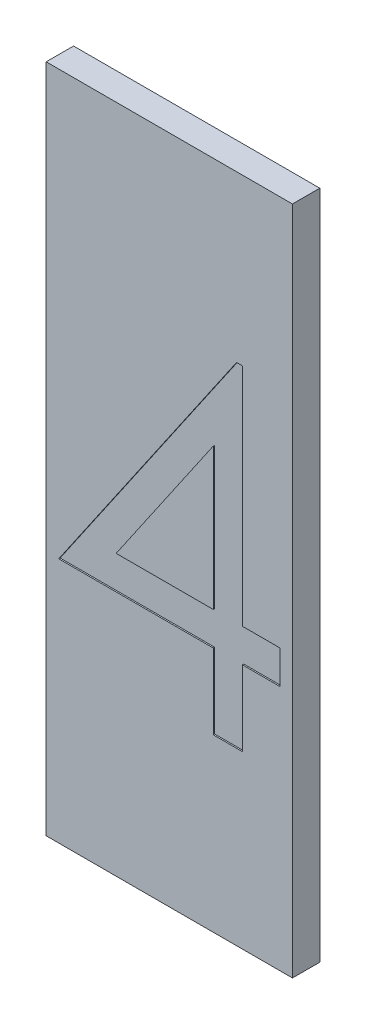
ISO-10303-21;
HEADER;
FILE_DESCRIPTION(('STEP AP214'),'2;1');
FILE_NAME('part.step','',(''),(''),'','','');
FILE_SCHEMA(('AUTOMOTIVE_DESIGN { 1 0 10303 214 1 1 1 1 }'));
ENDSEC;
DATA;
#1=APPLICATION_CONTEXT('core data for automotive mechanical design processes');
#2=APPLICATION_PROTOCOL_DEFINITION('international standard','automotive_design',2000,#1);
#3=PRODUCT_CONTEXT('',#1,'mechanical');
#4=PRODUCT('Part','Part','',(#3));
#5=PRODUCT_RELATED_PRODUCT_CATEGORY('part','',(#4));
#6=PRODUCT_DEFINITION_FORMATION('','',#4);
#7=PRODUCT_DEFINITION_CONTEXT('part definition',#1,'design');
#8=PRODUCT_DEFINITION('design','',#6,#7);
#9=PRODUCT_DEFINITION_SHAPE('','',#8);
#10=(LENGTH_UNIT() NAMED_UNIT(*) SI_UNIT(.MILLI.,.METRE.));
#11=(NAMED_UNIT(*) PLANE_ANGLE_UNIT() SI_UNIT($,.RADIAN.));
#12=(NAMED_UNIT(*) SI_UNIT($,.STERADIAN.) SOLID_ANGLE_UNIT());
#13=UNCERTAINTY_MEASURE_WITH_UNIT(LENGTH_MEASURE(1.E-05),#10,'distance_accuracy_value','');
#14=(GEOMETRIC_REPRESENTATION_CONTEXT(3) GLOBAL_UNCERTAINTY_ASSIGNED_CONTEXT((#13)) GLOBAL_UNIT_ASSIGNED_CONTEXT((#10,
#11,#12)) REPRESENTATION_CONTEXT('',''));
#15=CARTESIAN_POINT('',(0.,0.,0.));
#16=DIRECTION('',(0.,0.,1.));
#17=DIRECTION('',(1.,0.,0.));
#18=AXIS2_PLACEMENT_3D('',#15,#16,#17);
#19=CARTESIAN_POINT('',(0.,0.,2.));
#20=DIRECTION('',(0.,0.,1.));
#21=DIRECTION('',(1.,0.,0.));
#22=AXIS2_PLACEMENT_3D('',#19,#20,#21);
#23=PLANE('',#22);
#24=DIRECTION('',(0.,-1.,0.));
#25=VECTOR('',#24,1.);
#26=CARTESIAN_POINT('',(0.,0.,2.));
#27=LINE('',#26,#25);
#28=CARTESIAN_POINT('',(0.,49.,2.));
#29=VERTEX_POINT('',#28);
#30=CARTESIAN_POINT('',(0.,0.,2.));
#31=VERTEX_POINT('',#30);
#32=EDGE_CURVE('E256',#29,#31,#27,.T.);
#33=ORIENTED_EDGE('',*,*,#32,.T.);
#34=DIRECTION('',(1.,0.,0.));
#35=VECTOR('',#34,1.);
#36=CARTESIAN_POINT('',(18.,0.,2.));
#37=LINE('',#36,#35);
#38=CARTESIAN_POINT('',(18.,0.,2.));
#39=VERTEX_POINT('',#38);
#40=EDGE_CURVE('E259',#31,#39,#37,.T.);
#41=ORIENTED_EDGE('',*,*,#40,.T.);
#42=DIRECTION('',(0.,1.,0.));
#43=VECTOR('',#42,1.);
#44=CARTESIAN_POINT('',(18.,0.,2.));
#45=LINE('',#44,#43);
#46=CARTESIAN_POINT('',(18.,49.,2.));
#47=VERTEX_POINT('',#46);
#48=EDGE_CURVE('E262',#39,#47,#45,.T.);
#49=ORIENTED_EDGE('',*,*,#48,.T.);
#50=DIRECTION('',(-1.,0.,0.));
#51=VECTOR('',#50,1.);
#52=CARTESIAN_POINT('',(18.,49.,2.));
#53=LINE('',#52,#51);
#54=EDGE_CURVE('E264',#47,#29,#53,.T.);
#55=ORIENTED_EDGE('',*,*,#54,.T.);
#56=EDGE_LOOP('',(#33,#41,#49,#55));
#57=FACE_BOUND('',#56,.T.);
#58=DIRECTION('',(-1.,0.,0.));
#59=VECTOR('',#58,1.);
#60=CARTESIAN_POINT('',(12.2115384615385,17.9951923076923,2.));
#61=LINE('',#60,#59);
#62=CARTESIAN_POINT('',(12.2115384615385,17.9951923076923,2.));
#63=VERTEX_POINT('',#62);
#64=CARTESIAN_POINT('',(0.915865384615385,17.9951923076923,2.));
#65=VERTEX_POINT('',#64);
#66=EDGE_CURVE('E190',#63,#65,#61,.T.);
#67=ORIENTED_EDGE('',*,*,#66,.T.);
#68=DIRECTION('',(0.566105543193208,0.824332768950697,0.));
#69=VECTOR('',#68,1.);
#70=CARTESIAN_POINT('',(0.915865384615385,17.9951923076923,2.));
#71=LINE('',#70,#69);
#72=CARTESIAN_POINT('',(13.9144756610577,36.9230769230769,2.));
#73=VERTEX_POINT('',#72);
#74=EDGE_CURVE('E48',#65,#73,#71,.T.);
#75=ORIENTED_EDGE('',*,*,#74,.T.);
#76=DIRECTION('',(1.,0.,0.));
#77=VECTOR('',#76,1.);
#78=CARTESIAN_POINT('',(13.9144756610577,36.9230769230769,2.));
#79=LINE('',#78,#77);
#80=CARTESIAN_POINT('',(14.3485576923077,36.9230769230769,2.));
#81=VERTEX_POINT('',#80);
#82=EDGE_CURVE('E210',#73,#81,#79,.T.);
#83=ORIENTED_EDGE('',*,*,#82,.T.);
#84=DIRECTION('',(0.,-1.,0.));
#85=VECTOR('',#84,1.);
#86=CARTESIAN_POINT('',(14.3485576923077,36.9230769230769,2.));
#87=LINE('',#86,#85);
#88=CARTESIAN_POINT('',(14.3485576923077,20.4375,2.));
#89=VERTEX_POINT('',#88);
#90=EDGE_CURVE('E213',#81,#89,#87,.T.);
#91=ORIENTED_EDGE('',*,*,#90,.T.);
#92=DIRECTION('',(1.,0.,0.));
#93=VECTOR('',#92,1.);
#94=CARTESIAN_POINT('',(14.3485576923077,20.4375,2.));
#95=LINE('',#94,#93);
#96=CARTESIAN_POINT('',(17.0961538461538,20.4375,2.));
#97=VERTEX_POINT('',#96);
#98=EDGE_CURVE('E216',#89,#97,#95,.T.);
#99=ORIENTED_EDGE('',*,*,#98,.T.);
#100=DIRECTION('',(0.,-1.,0.));
#101=VECTOR('',#100,1.);
#102=CARTESIAN_POINT('',(17.0961538461538,20.4375,2.));
#103=LINE('',#102,#101);
#104=CARTESIAN_POINT('',(17.0961538461538,17.9951923076923,2.));
#105=VERTEX_POINT('',#104);
#106=EDGE_CURVE('E219',#97,#105,#103,.T.);
#107=ORIENTED_EDGE('',*,*,#106,.T.);
#108=DIRECTION('',(-1.,0.,0.));
#109=VECTOR('',#108,1.);
#110=CARTESIAN_POINT('',(17.0961538461538,17.9951923076923,2.));
#111=LINE('',#110,#109);
#112=CARTESIAN_POINT('',(14.3485576923077,17.9951923076923,2.));
#113=VERTEX_POINT('',#112);
#114=EDGE_CURVE('E222',#105,#113,#111,.T.);
#115=ORIENTED_EDGE('',*,*,#114,.T.);
#116=DIRECTION('',(0.,-1.,0.));
#117=VECTOR('',#116,1.);
#118=CARTESIAN_POINT('',(14.3485576923077,17.9951923076923,2.));
#119=LINE('',#118,#117);
#120=CARTESIAN_POINT('',(14.3485576923077,12.5,2.));
#121=VERTEX_POINT('',#120);
#122=EDGE_CURVE('E225',#113,#121,#119,.T.);
#123=ORIENTED_EDGE('',*,*,#122,.T.);
#124=DIRECTION('',(-1.,0.,0.));
#125=VECTOR('',#124,1.);
#126=CARTESIAN_POINT('',(14.3485576923077,12.5,2.));
#127=LINE('',#126,#125);
#128=CARTESIAN_POINT('',(12.2115384615385,12.5,2.));
#129=VERTEX_POINT('',#128);
#130=EDGE_CURVE('E228',#121,#129,#127,.T.);
#131=ORIENTED_EDGE('',*,*,#130,.T.);
#132=DIRECTION('',(0.,1.,0.));
#133=VECTOR('',#132,1.);
#134=CARTESIAN_POINT('',(12.2115384615385,12.5,2.));
#135=LINE('',#134,#133);
#136=EDGE_CURVE('E231',#129,#63,#135,.T.);
#137=ORIENTED_EDGE('',*,*,#136,.T.);
#138=EDGE_LOOP('',(#67,#75,#83,#91,#99,#107,#115,#123,#131,#137));
#139=FACE_BOUND('',#138,.T.);
#140=ADVANCED_FACE('F33',(#57,#139),#23,.T.);
#141=CARTESIAN_POINT('',(0.,0.,2.));
#142=DIRECTION('',(1.,0.,0.));
#143=DIRECTION('',(0.,0.,-1.));
#144=AXIS2_PLACEMENT_3D('',#141,#142,#143);
#145=PLANE('',#144);
#146=DIRECTION('',(0.,-1.,0.));
#147=VECTOR('',#146,1.);
#148=CARTESIAN_POINT('',(0.,0.,0.));
#149=LINE('',#148,#147);
#150=CARTESIAN_POINT('',(0.,49.,0.));
#151=VERTEX_POINT('',#150);
#152=CARTESIAN_POINT('',(0.,0.,0.));
#153=VERTEX_POINT('',#152);
#154=EDGE_CURVE('E255',#151,#153,#149,.T.);
#155=ORIENTED_EDGE('',*,*,#154,.T.);
#156=DIRECTION('',(0.,0.,-1.));
#157=VECTOR('',#156,1.);
#158=CARTESIAN_POINT('',(0.,0.,2.));
#159=LINE('',#158,#157);
#160=EDGE_CURVE('E11',#31,#153,#159,.T.);
#161=ORIENTED_EDGE('',*,*,#160,.F.);
#162=ORIENTED_EDGE('',*,*,#32,.F.);
#163=DIRECTION('',(0.,0.,-1.));
#164=VECTOR('',#163,1.);
#165=CARTESIAN_POINT('',(0.,49.,2.));
#166=LINE('',#165,#164);
#167=EDGE_CURVE('E266',#29,#151,#166,.T.);
#168=ORIENTED_EDGE('',*,*,#167,.T.);
#169=EDGE_LOOP('',(#155,#161,#162,#168));
#170=FACE_BOUND('',#169,.T.);
#171=ADVANCED_FACE('F35',(#170),#145,.F.);
#172=CARTESIAN_POINT('',(18.,0.,2.));
#173=DIRECTION('',(0.,1.,0.));
#174=DIRECTION('',(0.,0.,1.));
#175=AXIS2_PLACEMENT_3D('',#172,#173,#174);
#176=PLANE('',#175);
#177=DIRECTION('',(1.,0.,0.));
#178=VECTOR('',#177,1.);
#179=CARTESIAN_POINT('',(18.,0.,0.));
#180=LINE('',#179,#178);
#181=CARTESIAN_POINT('',(18.,0.,0.));
#182=VERTEX_POINT('',#181);
#183=EDGE_CURVE('E269',#153,#182,#180,.T.);
#184=ORIENTED_EDGE('',*,*,#183,.T.);
#185=DIRECTION('',(0.,0.,-1.));
#186=VECTOR('',#185,1.);
#187=CARTESIAN_POINT('',(18.,0.,2.));
#188=LINE('',#187,#186);
#189=EDGE_CURVE('E41',#39,#182,#188,.T.);
#190=ORIENTED_EDGE('',*,*,#189,.F.);
#191=ORIENTED_EDGE('',*,*,#40,.F.);
#192=ORIENTED_EDGE('',*,*,#160,.T.);
#193=EDGE_LOOP('',(#184,#190,#191,#192));
#194=FACE_BOUND('',#193,.T.);
#195=ADVANCED_FACE('F299',(#194),#176,.F.);
#196=CARTESIAN_POINT('',(18.,0.,2.));
#197=DIRECTION('',(-1.,0.,0.));
#198=DIRECTION('',(0.,0.,1.));
#199=AXIS2_PLACEMENT_3D('',#196,#197,#198);
#200=PLANE('',#199);
#201=DIRECTION('',(0.,1.,0.));
#202=VECTOR('',#201,1.);
#203=CARTESIAN_POINT('',(18.,0.,0.));
#204=LINE('',#203,#202);
#205=CARTESIAN_POINT('',(18.,49.,0.));
#206=VERTEX_POINT('',#205);
#207=EDGE_CURVE('E271',#182,#206,#204,.T.);
#208=ORIENTED_EDGE('',*,*,#207,.T.);
#209=DIRECTION('',(0.,0.,-1.));
#210=VECTOR('',#209,1.);
#211=CARTESIAN_POINT('',(18.,49.,2.));
#212=LINE('',#211,#210);
#213=EDGE_CURVE('E276',#47,#206,#212,.T.);
#214=ORIENTED_EDGE('',*,*,#213,.F.);
#215=ORIENTED_EDGE('',*,*,#48,.F.);
#216=ORIENTED_EDGE('',*,*,#189,.T.);
#217=EDGE_LOOP('',(#208,#214,#215,#216));
#218=FACE_BOUND('',#217,.T.);
#219=ADVANCED_FACE('F283',(#218),#200,.F.);
#220=CARTESIAN_POINT('',(18.,49.,2.));
#221=DIRECTION('',(0.,-1.,0.));
#222=DIRECTION('',(0.,0.,-1.));
#223=AXIS2_PLACEMENT_3D('',#220,#221,#222);
#224=PLANE('',#223);
#225=DIRECTION('',(-1.,0.,0.));
#226=VECTOR('',#225,1.);
#227=CARTESIAN_POINT('',(18.,49.,0.));
#228=LINE('',#227,#226);
#229=EDGE_CURVE('E260',#206,#151,#228,.T.);
#230=ORIENTED_EDGE('',*,*,#229,.T.);
#231=ORIENTED_EDGE('',*,*,#167,.F.);
#232=ORIENTED_EDGE('',*,*,#54,.F.);
#233=ORIENTED_EDGE('',*,*,#213,.T.);
#234=EDGE_LOOP('',(#230,#231,#232,#233));
#235=FACE_BOUND('',#234,.T.);
#236=ADVANCED_FACE('F292',(#235),#224,.F.);
#237=CARTESIAN_POINT('',(0.,0.,0.));
#238=DIRECTION('',(0.,0.,1.));
#239=DIRECTION('',(1.,0.,0.));
#240=AXIS2_PLACEMENT_3D('',#237,#238,#239);
#241=PLANE('',#240);
#242=ORIENTED_EDGE('',*,*,#154,.F.);
#243=ORIENTED_EDGE('',*,*,#229,.F.);
#244=ORIENTED_EDGE('',*,*,#207,.F.);
#245=ORIENTED_EDGE('',*,*,#183,.F.);
#246=EDGE_LOOP('',(#242,#243,#244,#245));
#247=FACE_BOUND('',#246,.T.);
#248=ADVANCED_FACE('F289',(#247),#241,.F.);
#249=CARTESIAN_POINT('',(0.915865384615385,17.9951923076923,1.9));
#250=DIRECTION('',(0.824332768950697,-0.566105543193208,0.));
#251=DIRECTION('',(0.566105543193208,0.824332768950697,0.));
#252=AXIS2_PLACEMENT_3D('',#249,#250,#251);
#253=PLANE('',#252);
#254=ORIENTED_EDGE('',*,*,#74,.F.);
#255=DIRECTION('',(0.,0.,1.));
#256=VECTOR('',#255,1.);
#257=CARTESIAN_POINT('',(0.915865384615385,17.9951923076923,1.9));
#258=LINE('',#257,#256);
#259=CARTESIAN_POINT('',(0.915865384615385,17.9951923076923,1.9));
#260=VERTEX_POINT('',#259);
#261=EDGE_CURVE('E208',#260,#65,#258,.T.);
#262=ORIENTED_EDGE('',*,*,#261,.F.);
#263=DIRECTION('',(0.566105543193208,0.824332768950697,0.));
#264=VECTOR('',#263,1.);
#265=CARTESIAN_POINT('',(0.915865384615385,17.9951923076923,1.9));
#266=LINE('',#265,#264);
#267=CARTESIAN_POINT('',(13.9144756610577,36.9230769230769,1.9));
#268=VERTEX_POINT('',#267);
#269=EDGE_CURVE('E186',#260,#268,#266,.T.);
#270=ORIENTED_EDGE('',*,*,#269,.T.);
#271=DIRECTION('',(0.,0.,1.));
#272=VECTOR('',#271,1.);
#273=CARTESIAN_POINT('',(13.9144756610577,36.9230769230769,1.9));
#274=LINE('',#273,#272);
#275=EDGE_CURVE('E253',#268,#73,#274,.T.);
#276=ORIENTED_EDGE('',*,*,#275,.T.);
#277=EDGE_LOOP('',(#254,#262,#270,#276));
#278=FACE_BOUND('',#277,.T.);
#279=ADVANCED_FACE('F363',(#278),#253,.T.);
#280=CARTESIAN_POINT('',(13.9144756610577,36.9230769230769,1.9));
#281=DIRECTION('',(0.,-1.,0.));
#282=DIRECTION('',(0.,0.,-1.));
#283=AXIS2_PLACEMENT_3D('',#280,#281,#282);
#284=PLANE('',#283);
#285=ORIENTED_EDGE('',*,*,#82,.F.);
#286=ORIENTED_EDGE('',*,*,#275,.F.);
#287=DIRECTION('',(1.,0.,0.));
#288=VECTOR('',#287,1.);
#289=CARTESIAN_POINT('',(13.9144756610577,36.9230769230769,1.9));
#290=LINE('',#289,#288);
#291=CARTESIAN_POINT('',(14.3485576923077,36.9230769230769,1.9));
#292=VERTEX_POINT('',#291);
#293=EDGE_CURVE('E189',#268,#292,#290,.T.);
#294=ORIENTED_EDGE('',*,*,#293,.T.);
#295=DIRECTION('',(0.,0.,1.));
#296=VECTOR('',#295,1.);
#297=CARTESIAN_POINT('',(14.3485576923077,36.9230769230769,1.9));
#298=LINE('',#297,#296);
#299=EDGE_CURVE('E251',#292,#81,#298,.T.);
#300=ORIENTED_EDGE('',*,*,#299,.T.);
#301=EDGE_LOOP('',(#285,#286,#294,#300));
#302=FACE_BOUND('',#301,.T.);
#303=ADVANCED_FACE('F360',(#302),#284,.T.);
#304=CARTESIAN_POINT('',(14.3485576923077,36.9230769230769,1.9));
#305=DIRECTION('',(-1.,0.,0.));
#306=DIRECTION('',(0.,0.,1.));
#307=AXIS2_PLACEMENT_3D('',#304,#305,#306);
#308=PLANE('',#307);
#309=ORIENTED_EDGE('',*,*,#90,.F.);
#310=ORIENTED_EDGE('',*,*,#299,.F.);
#311=DIRECTION('',(0.,-1.,0.));
#312=VECTOR('',#311,1.);
#313=CARTESIAN_POINT('',(14.3485576923077,36.9230769230769,1.9));
#314=LINE('',#313,#312);
#315=CARTESIAN_POINT('',(14.3485576923077,20.4375,1.9));
#316=VERTEX_POINT('',#315);
#317=EDGE_CURVE('E192',#292,#316,#314,.T.);
#318=ORIENTED_EDGE('',*,*,#317,.T.);
#319=DIRECTION('',(0.,0.,1.));
#320=VECTOR('',#319,1.);
#321=CARTESIAN_POINT('',(14.3485576923077,20.4375,1.9));
#322=LINE('',#321,#320);
#323=EDGE_CURVE('E249',#316,#89,#322,.T.);
#324=ORIENTED_EDGE('',*,*,#323,.T.);
#325=EDGE_LOOP('',(#309,#310,#318,#324));
#326=FACE_BOUND('',#325,.T.);
#327=ADVANCED_FACE('F356',(#326),#308,.T.);
#328=CARTESIAN_POINT('',(14.3485576923077,20.4375,1.9));
#329=DIRECTION('',(0.,-1.,0.));
#330=DIRECTION('',(0.,0.,-1.));
#331=AXIS2_PLACEMENT_3D('',#328,#329,#330);
#332=PLANE('',#331);
#333=ORIENTED_EDGE('',*,*,#98,.F.);
#334=ORIENTED_EDGE('',*,*,#323,.F.);
#335=DIRECTION('',(1.,0.,0.));
#336=VECTOR('',#335,1.);
#337=CARTESIAN_POINT('',(14.3485576923077,20.4375,1.9));
#338=LINE('',#337,#336);
#339=CARTESIAN_POINT('',(17.0961538461538,20.4375,1.9));
#340=VERTEX_POINT('',#339);
#341=EDGE_CURVE('E194',#316,#340,#338,.T.);
#342=ORIENTED_EDGE('',*,*,#341,.T.);
#343=DIRECTION('',(0.,0.,1.));
#344=VECTOR('',#343,1.);
#345=CARTESIAN_POINT('',(17.0961538461538,20.4375,1.9));
#346=LINE('',#345,#344);
#347=EDGE_CURVE('E247',#340,#97,#346,.T.);
#348=ORIENTED_EDGE('',*,*,#347,.T.);
#349=EDGE_LOOP('',(#333,#334,#342,#348));
#350=FACE_BOUND('',#349,.T.);
#351=ADVANCED_FACE('F352',(#350),#332,.T.);
#352=CARTESIAN_POINT('',(17.0961538461538,20.4375,1.9));
#353=DIRECTION('',(-1.,0.,0.));
#354=DIRECTION('',(0.,0.,1.));
#355=AXIS2_PLACEMENT_3D('',#352,#353,#354);
#356=PLANE('',#355);
#357=ORIENTED_EDGE('',*,*,#106,.F.);
#358=ORIENTED_EDGE('',*,*,#347,.F.);
#359=DIRECTION('',(0.,-1.,0.));
#360=VECTOR('',#359,1.);
#361=CARTESIAN_POINT('',(17.0961538461538,20.4375,1.9));
#362=LINE('',#361,#360);
#363=CARTESIAN_POINT('',(17.0961538461538,17.9951923076923,1.9));
#364=VERTEX_POINT('',#363);
#365=EDGE_CURVE('E196',#340,#364,#362,.T.);
#366=ORIENTED_EDGE('',*,*,#365,.T.);
#367=DIRECTION('',(0.,0.,1.));
#368=VECTOR('',#367,1.);
#369=CARTESIAN_POINT('',(17.0961538461538,17.9951923076923,1.9));
#370=LINE('',#369,#368);
#371=EDGE_CURVE('E245',#364,#105,#370,.T.);
#372=ORIENTED_EDGE('',*,*,#371,.T.);
#373=EDGE_LOOP('',(#357,#358,#366,#372));
#374=FACE_BOUND('',#373,.T.);
#375=ADVANCED_FACE('F348',(#374),#356,.T.);
#376=CARTESIAN_POINT('',(17.0961538461538,17.9951923076923,1.9));
#377=DIRECTION('',(0.,1.,0.));
#378=DIRECTION('',(0.,0.,1.));
#379=AXIS2_PLACEMENT_3D('',#376,#377,#378);
#380=PLANE('',#379);
#381=ORIENTED_EDGE('',*,*,#114,.F.);
#382=ORIENTED_EDGE('',*,*,#371,.F.);
#383=DIRECTION('',(-1.,0.,0.));
#384=VECTOR('',#383,1.);
#385=CARTESIAN_POINT('',(17.0961538461538,17.9951923076923,1.9));
#386=LINE('',#385,#384);
#387=CARTESIAN_POINT('',(14.3485576923077,17.9951923076923,1.9));
#388=VERTEX_POINT('',#387);
#389=EDGE_CURVE('E198',#364,#388,#386,.T.);
#390=ORIENTED_EDGE('',*,*,#389,.T.);
#391=DIRECTION('',(0.,0.,1.));
#392=VECTOR('',#391,1.);
#393=CARTESIAN_POINT('',(14.3485576923077,17.9951923076923,1.9));
#394=LINE('',#393,#392);
#395=EDGE_CURVE('E243',#388,#113,#394,.T.);
#396=ORIENTED_EDGE('',*,*,#395,.T.);
#397=EDGE_LOOP('',(#381,#382,#390,#396));
#398=FACE_BOUND('',#397,.T.);
#399=ADVANCED_FACE('F344',(#398),#380,.T.);
#400=CARTESIAN_POINT('',(14.3485576923077,17.9951923076923,1.9));
#401=DIRECTION('',(-1.,0.,0.));
#402=DIRECTION('',(0.,0.,1.));
#403=AXIS2_PLACEMENT_3D('',#400,#401,#402);
#404=PLANE('',#403);
#405=ORIENTED_EDGE('',*,*,#122,.F.);
#406=ORIENTED_EDGE('',*,*,#395,.F.);
#407=DIRECTION('',(0.,-1.,0.));
#408=VECTOR('',#407,1.);
#409=CARTESIAN_POINT('',(14.3485576923077,17.9951923076923,1.9));
#410=LINE('',#409,#408);
#411=CARTESIAN_POINT('',(14.3485576923077,12.5,1.9));
#412=VERTEX_POINT('',#411);
#413=EDGE_CURVE('E200',#388,#412,#410,.T.);
#414=ORIENTED_EDGE('',*,*,#413,.T.);
#415=DIRECTION('',(0.,0.,1.));
#416=VECTOR('',#415,1.);
#417=CARTESIAN_POINT('',(14.3485576923077,12.5,1.9));
#418=LINE('',#417,#416);
#419=EDGE_CURVE('E241',#412,#121,#418,.T.);
#420=ORIENTED_EDGE('',*,*,#419,.T.);
#421=EDGE_LOOP('',(#405,#406,#414,#420));
#422=FACE_BOUND('',#421,.T.);
#423=ADVANCED_FACE('F340',(#422),#404,.T.);
#424=CARTESIAN_POINT('',(14.3485576923077,12.5,1.9));
#425=DIRECTION('',(0.,1.,0.));
#426=DIRECTION('',(0.,0.,1.));
#427=AXIS2_PLACEMENT_3D('',#424,#425,#426);
#428=PLANE('',#427);
#429=ORIENTED_EDGE('',*,*,#130,.F.);
#430=ORIENTED_EDGE('',*,*,#419,.F.);
#431=DIRECTION('',(-1.,0.,0.));
#432=VECTOR('',#431,1.);
#433=CARTESIAN_POINT('',(14.3485576923077,12.5,1.9));
#434=LINE('',#433,#432);
#435=CARTESIAN_POINT('',(12.2115384615385,12.5,1.9));
#436=VERTEX_POINT('',#435);
#437=EDGE_CURVE('E202',#412,#436,#434,.T.);
#438=ORIENTED_EDGE('',*,*,#437,.T.);
#439=DIRECTION('',(0.,0.,1.));
#440=VECTOR('',#439,1.);
#441=CARTESIAN_POINT('',(12.2115384615385,12.5,1.9));
#442=LINE('',#441,#440);
#443=EDGE_CURVE('E239',#436,#129,#442,.T.);
#444=ORIENTED_EDGE('',*,*,#443,.T.);
#445=EDGE_LOOP('',(#429,#430,#438,#444));
#446=FACE_BOUND('',#445,.T.);
#447=ADVANCED_FACE('F336',(#446),#428,.T.);
#448=CARTESIAN_POINT('',(12.2115384615385,12.5,1.9));
#449=DIRECTION('',(1.,0.,0.));
#450=DIRECTION('',(0.,0.,-1.));
#451=AXIS2_PLACEMENT_3D('',#448,#449,#450);
#452=PLANE('',#451);
#453=ORIENTED_EDGE('',*,*,#136,.F.);
#454=ORIENTED_EDGE('',*,*,#443,.F.);
#455=DIRECTION('',(0.,1.,0.));
#456=VECTOR('',#455,1.);
#457=CARTESIAN_POINT('',(12.2115384615385,12.5,1.9));
#458=LINE('',#457,#456);
#459=CARTESIAN_POINT('',(12.2115384615385,17.9951923076923,1.9));
#460=VERTEX_POINT('',#459);
#461=EDGE_CURVE('E204',#436,#460,#458,.T.);
#462=ORIENTED_EDGE('',*,*,#461,.T.);
#463=DIRECTION('',(0.,0.,1.));
#464=VECTOR('',#463,1.);
#465=CARTESIAN_POINT('',(12.2115384615385,17.9951923076923,1.9));
#466=LINE('',#465,#464);
#467=EDGE_CURVE('E237',#460,#63,#466,.T.);
#468=ORIENTED_EDGE('',*,*,#467,.T.);
#469=EDGE_LOOP('',(#453,#454,#462,#468));
#470=FACE_BOUND('',#469,.T.);
#471=ADVANCED_FACE('F332',(#470),#452,.T.);
#472=CARTESIAN_POINT('',(12.2115384615385,17.9951923076923,1.9));
#473=DIRECTION('',(0.,1.,0.));
#474=DIRECTION('',(0.,0.,1.));
#475=AXIS2_PLACEMENT_3D('',#472,#473,#474);
#476=PLANE('',#475);
#477=ORIENTED_EDGE('',*,*,#66,.F.);
#478=ORIENTED_EDGE('',*,*,#467,.F.);
#479=DIRECTION('',(-1.,0.,0.));
#480=VECTOR('',#479,1.);
#481=CARTESIAN_POINT('',(12.2115384615385,17.9951923076923,1.9));
#482=LINE('',#481,#480);
#483=EDGE_CURVE('E206',#460,#260,#482,.T.);
#484=ORIENTED_EDGE('',*,*,#483,.T.);
#485=ORIENTED_EDGE('',*,*,#261,.T.);
#486=EDGE_LOOP('',(#477,#478,#484,#485));
#487=FACE_BOUND('',#486,.T.);
#488=ADVANCED_FACE('F329',(#487),#476,.T.);
#489=CARTESIAN_POINT('',(0.,0.,1.9));
#490=DIRECTION('',(0.,0.,-1.));
#491=DIRECTION('',(-1.,0.,0.));
#492=AXIS2_PLACEMENT_3D('',#489,#490,#491);
#493=PLANE('',#492);
#494=DIRECTION('',(1.,0.,0.));
#495=VECTOR('',#494,1.);
#496=CARTESIAN_POINT('',(5.11358173076923,20.4375,1.9));
#497=LINE('',#496,#495);
#498=CARTESIAN_POINT('',(5.11358173076923,20.4375,1.9));
#499=VERTEX_POINT('',#498);
#500=CARTESIAN_POINT('',(12.2115384615385,20.4375,1.9));
#501=VERTEX_POINT('',#500);
#502=EDGE_CURVE('E172',#499,#501,#497,.T.);
#503=ORIENTED_EDGE('',*,*,#502,.F.);
#504=DIRECTION('',(-0.565883050718714,-0.82448552013318,0.));
#505=VECTOR('',#504,1.);
#506=CARTESIAN_POINT('',(12.2115384615385,30.7791466346154,1.9));
#507=LINE('',#506,#505);
#508=CARTESIAN_POINT('',(12.2115384615385,30.7791466346154,1.9));
#509=VERTEX_POINT('',#508);
#510=EDGE_CURVE('E166',#509,#499,#507,.T.);
#511=ORIENTED_EDGE('',*,*,#510,.F.);
#512=DIRECTION('',(0.,1.,0.));
#513=VECTOR('',#512,1.);
#514=CARTESIAN_POINT('',(12.2115384615385,20.4375,1.9));
#515=LINE('',#514,#513);
#516=EDGE_CURVE('E158',#501,#509,#515,.T.);
#517=ORIENTED_EDGE('',*,*,#516,.F.);
#518=EDGE_LOOP('',(#503,#511,#517));
#519=FACE_BOUND('',#518,.T.);
#520=ORIENTED_EDGE('',*,*,#269,.F.);
#521=ORIENTED_EDGE('',*,*,#483,.F.);
#522=ORIENTED_EDGE('',*,*,#461,.F.);
#523=ORIENTED_EDGE('',*,*,#437,.F.);
#524=ORIENTED_EDGE('',*,*,#413,.F.);
#525=ORIENTED_EDGE('',*,*,#389,.F.);
#526=ORIENTED_EDGE('',*,*,#365,.F.);
#527=ORIENTED_EDGE('',*,*,#341,.F.);
#528=ORIENTED_EDGE('',*,*,#317,.F.);
#529=ORIENTED_EDGE('',*,*,#293,.F.);
#530=EDGE_LOOP('',(#520,#521,#522,#523,#524,#525,#526,#527,#528,#529));
#531=FACE_BOUND('',#530,.T.);
#532=ADVANCED_FACE('F170',(#519,#531),#493,.F.);
#533=CARTESIAN_POINT('',(5.11358173076923,20.4375,1.9));
#534=DIRECTION('',(0.,-1.,0.));
#535=DIRECTION('',(0.,0.,-1.));
#536=AXIS2_PLACEMENT_3D('',#533,#534,#535);
#537=PLANE('',#536);
#538=DIRECTION('',(1.,0.,0.));
#539=VECTOR('',#538,1.);
#540=CARTESIAN_POINT('',(5.11358173076923,20.4375,2.));
#541=LINE('',#540,#539);
#542=CARTESIAN_POINT('',(5.11358173076923,20.4375,2.));
#543=VERTEX_POINT('',#542);
#544=CARTESIAN_POINT('',(12.2115384615385,20.4375,2.));
#545=VERTEX_POINT('',#544);
#546=EDGE_CURVE('E181',#543,#545,#541,.T.);
#547=ORIENTED_EDGE('',*,*,#546,.F.);
#548=DIRECTION('',(0.,0.,1.));
#549=VECTOR('',#548,1.);
#550=CARTESIAN_POINT('',(5.11358173076923,20.4375,1.9));
#551=LINE('',#550,#549);
#552=EDGE_CURVE('E176',#499,#543,#551,.T.);
#553=ORIENTED_EDGE('',*,*,#552,.F.);
#554=ORIENTED_EDGE('',*,*,#502,.T.);
#555=DIRECTION('',(0.,0.,1.));
#556=VECTOR('',#555,1.);
#557=CARTESIAN_POINT('',(12.2115384615385,20.4375,1.9));
#558=LINE('',#557,#556);
#559=EDGE_CURVE('E155',#501,#545,#558,.T.);
#560=ORIENTED_EDGE('',*,*,#559,.T.);
#561=EDGE_LOOP('',(#547,#553,#554,#560));
#562=FACE_BOUND('',#561,.T.);
#563=ADVANCED_FACE('F175',(#562),#537,.T.);
#564=CARTESIAN_POINT('',(12.2115384615385,30.7791466346154,1.9));
#565=DIRECTION('',(-0.824485520133181,0.565883050718714,0.));
#566=DIRECTION('',(-0.565883050718714,-0.824485520133181,0.));
#567=AXIS2_PLACEMENT_3D('',#564,#565,#566);
#568=PLANE('',#567);
#569=DIRECTION('',(-0.565883050718714,-0.82448552013318,0.));
#570=VECTOR('',#569,1.);
#571=CARTESIAN_POINT('',(12.2115384615385,30.7791466346154,2.));
#572=LINE('',#571,#570);
#573=CARTESIAN_POINT('',(12.2115384615385,30.7791466346154,2.));
#574=VERTEX_POINT('',#573);
#575=EDGE_CURVE('E56',#574,#543,#572,.T.);
#576=ORIENTED_EDGE('',*,*,#575,.F.);
#577=DIRECTION('',(0.,0.,1.));
#578=VECTOR('',#577,1.);
#579=CARTESIAN_POINT('',(12.2115384615385,30.7791466346154,1.9));
#580=LINE('',#579,#578);
#581=EDGE_CURVE('E165',#509,#574,#580,.T.);
#582=ORIENTED_EDGE('',*,*,#581,.F.);
#583=ORIENTED_EDGE('',*,*,#510,.T.);
#584=ORIENTED_EDGE('',*,*,#552,.T.);
#585=EDGE_LOOP('',(#576,#582,#583,#584));
#586=FACE_BOUND('',#585,.T.);
#587=ADVANCED_FACE('F318',(#586),#568,.T.);
#588=CARTESIAN_POINT('',(12.2115384615385,20.4375,1.9));
#589=DIRECTION('',(1.,0.,0.));
#590=DIRECTION('',(0.,0.,-1.));
#591=AXIS2_PLACEMENT_3D('',#588,#589,#590);
#592=PLANE('',#591);
#593=DIRECTION('',(0.,1.,0.));
#594=VECTOR('',#593,1.);
#595=CARTESIAN_POINT('',(12.2115384615385,20.4375,2.));
#596=LINE('',#595,#594);
#597=EDGE_CURVE('E160',#545,#574,#596,.T.);
#598=ORIENTED_EDGE('',*,*,#597,.F.);
#599=ORIENTED_EDGE('',*,*,#559,.F.);
#600=ORIENTED_EDGE('',*,*,#516,.T.);
#601=ORIENTED_EDGE('',*,*,#581,.T.);
#602=EDGE_LOOP('',(#598,#599,#600,#601));
#603=FACE_BOUND('',#602,.T.);
#604=ADVANCED_FACE('F157',(#603),#592,.T.);
#605=ORIENTED_EDGE('',*,*,#575,.T.);
#606=ORIENTED_EDGE('',*,*,#546,.T.);
#607=ORIENTED_EDGE('',*,*,#597,.T.);
#608=EDGE_LOOP('',(#605,#606,#607));
#609=FACE_BOUND('',#608,.T.);
#610=ADVANCED_FACE('F308',(#609),#23,.T.);
#611=CLOSED_SHELL('',(#140,#171,#195,#219,#236,#248,#279,#303,#327,#351,#375,#399,#423,#447,
#471,#488,#532,#563,#587,#604,#610));
#612=MANIFOLD_SOLID_BREP('B2',#611);
#613=ADVANCED_BREP_SHAPE_REPRESENTATION('',(#18,#612),#14);
#614=SHAPE_DEFINITION_REPRESENTATION(#9,#613);
ENDSEC;
END-ISO-10303-21;
